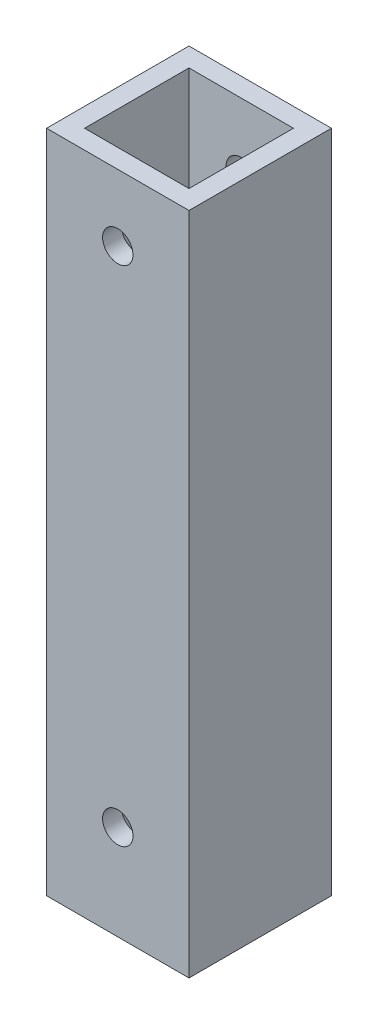
ISO-10303-21;
HEADER;
FILE_DESCRIPTION(('STEP AP214'),'2;1');
FILE_NAME('part.step','',(''),(''),'','','');
FILE_SCHEMA(('AUTOMOTIVE_DESIGN { 1 0 10303 214 1 1 1 1 }'));
ENDSEC;
DATA;
#1=APPLICATION_CONTEXT('core data for automotive mechanical design processes');
#2=APPLICATION_PROTOCOL_DEFINITION('international standard','automotive_design',2000,#1);
#3=PRODUCT_CONTEXT('',#1,'mechanical');
#4=PRODUCT('Part','Part','',(#3));
#5=PRODUCT_RELATED_PRODUCT_CATEGORY('part','',(#4));
#6=PRODUCT_DEFINITION_FORMATION('','',#4);
#7=PRODUCT_DEFINITION_CONTEXT('part definition',#1,'design');
#8=PRODUCT_DEFINITION('design','',#6,#7);
#9=PRODUCT_DEFINITION_SHAPE('','',#8);
#10=(LENGTH_UNIT() NAMED_UNIT(*) SI_UNIT(.MILLI.,.METRE.));
#11=(NAMED_UNIT(*) PLANE_ANGLE_UNIT() SI_UNIT($,.RADIAN.));
#12=(NAMED_UNIT(*) SI_UNIT($,.STERADIAN.) SOLID_ANGLE_UNIT());
#13=UNCERTAINTY_MEASURE_WITH_UNIT(LENGTH_MEASURE(1.E-05),#10,'distance_accuracy_value','');
#14=(GEOMETRIC_REPRESENTATION_CONTEXT(3) GLOBAL_UNCERTAINTY_ASSIGNED_CONTEXT((#13)) GLOBAL_UNIT_ASSIGNED_CONTEXT((#10,
#11,#12)) REPRESENTATION_CONTEXT('',''));
#15=CARTESIAN_POINT('',(0.,0.,0.));
#16=DIRECTION('',(0.,0.,1.));
#17=DIRECTION('',(1.,0.,0.));
#18=AXIS2_PLACEMENT_3D('',#15,#16,#17);
#19=CARTESIAN_POINT('',(0.,70.,0.));
#20=DIRECTION('',(0.,-1.,0.));
#21=DIRECTION('',(0.,0.,-1.));
#22=AXIS2_PLACEMENT_3D('',#19,#20,#21);
#23=PLANE('',#22);
#24=DIRECTION('',(0.,0.,1.));
#25=VECTOR('',#24,1.);
#26=CARTESIAN_POINT('',(0.,70.,0.));
#27=LINE('',#26,#25);
#28=CARTESIAN_POINT('',(0.,70.,-15.));
#29=VERTEX_POINT('',#28);
#30=CARTESIAN_POINT('',(0.,70.,0.));
#31=VERTEX_POINT('',#30);
#32=EDGE_CURVE('E147',#29,#31,#27,.T.);
#33=ORIENTED_EDGE('',*,*,#32,.T.);
#34=DIRECTION('',(1.,0.,0.));
#35=VECTOR('',#34,1.);
#36=CARTESIAN_POINT('',(0.,70.,0.));
#37=LINE('',#36,#35);
#38=CARTESIAN_POINT('',(15.,70.,0.));
#39=VERTEX_POINT('',#38);
#40=EDGE_CURVE('E150',#31,#39,#37,.T.);
#41=ORIENTED_EDGE('',*,*,#40,.T.);
#42=DIRECTION('',(0.,0.,-1.));
#43=VECTOR('',#42,1.);
#44=CARTESIAN_POINT('',(15.,70.,0.));
#45=LINE('',#44,#43);
#46=CARTESIAN_POINT('',(15.,70.,-15.));
#47=VERTEX_POINT('',#46);
#48=EDGE_CURVE('E153',#39,#47,#45,.T.);
#49=ORIENTED_EDGE('',*,*,#48,.T.);
#50=DIRECTION('',(-1.,0.,0.));
#51=VECTOR('',#50,1.);
#52=CARTESIAN_POINT('',(0.,70.,-15.));
#53=LINE('',#52,#51);
#54=EDGE_CURVE('E155',#47,#29,#53,.T.);
#55=ORIENTED_EDGE('',*,*,#54,.T.);
#56=EDGE_LOOP('',(#33,#41,#49,#55));
#57=FACE_BOUND('',#56,.T.);
#58=DIRECTION('',(1.,0.,0.));
#59=VECTOR('',#58,1.);
#60=CARTESIAN_POINT('',(2.,70.,-2.));
#61=LINE('',#60,#59);
#62=CARTESIAN_POINT('',(2.,70.,-2.));
#63=VERTEX_POINT('',#62);
#64=CARTESIAN_POINT('',(13.,70.,-2.));
#65=VERTEX_POINT('',#64);
#66=EDGE_CURVE('E109',#63,#65,#61,.T.);
#67=ORIENTED_EDGE('',*,*,#66,.F.);
#68=DIRECTION('',(0.,0.,1.));
#69=VECTOR('',#68,1.);
#70=CARTESIAN_POINT('',(2.,70.,-2.));
#71=LINE('',#70,#69);
#72=CARTESIAN_POINT('',(2.,70.,-13.));
#73=VERTEX_POINT('',#72);
#74=EDGE_CURVE('E131',#73,#63,#71,.T.);
#75=ORIENTED_EDGE('',*,*,#74,.F.);
#76=DIRECTION('',(-1.,0.,0.));
#77=VECTOR('',#76,1.);
#78=CARTESIAN_POINT('',(2.,70.,-13.));
#79=LINE('',#78,#77);
#80=CARTESIAN_POINT('',(13.,70.,-13.));
#81=VERTEX_POINT('',#80);
#82=EDGE_CURVE('E129',#81,#73,#79,.T.);
#83=ORIENTED_EDGE('',*,*,#82,.F.);
#84=DIRECTION('',(0.,0.,-1.));
#85=VECTOR('',#84,1.);
#86=CARTESIAN_POINT('',(13.,70.,-2.));
#87=LINE('',#86,#85);
#88=EDGE_CURVE('E117',#65,#81,#87,.T.);
#89=ORIENTED_EDGE('',*,*,#88,.F.);
#90=EDGE_LOOP('',(#67,#75,#83,#89));
#91=FACE_BOUND('',#90,.T.);
#92=ADVANCED_FACE('F42',(#57,#91),#23,.F.);
#93=CARTESIAN_POINT('',(0.,0.,0.));
#94=DIRECTION('',(0.,-1.,0.));
#95=DIRECTION('',(0.,0.,-1.));
#96=AXIS2_PLACEMENT_3D('',#93,#94,#95);
#97=PLANE('',#96);
#98=DIRECTION('',(0.,0.,1.));
#99=VECTOR('',#98,1.);
#100=CARTESIAN_POINT('',(0.,0.,0.));
#101=LINE('',#100,#99);
#102=CARTESIAN_POINT('',(0.,0.,-15.));
#103=VERTEX_POINT('',#102);
#104=CARTESIAN_POINT('',(0.,0.,0.));
#105=VERTEX_POINT('',#104);
#106=EDGE_CURVE('E125',#103,#105,#101,.T.);
#107=ORIENTED_EDGE('',*,*,#106,.F.);
#108=DIRECTION('',(-1.,0.,0.));
#109=VECTOR('',#108,1.);
#110=CARTESIAN_POINT('',(0.,0.,-15.));
#111=LINE('',#110,#109);
#112=CARTESIAN_POINT('',(15.,0.,-15.));
#113=VERTEX_POINT('',#112);
#114=EDGE_CURVE('E151',#113,#103,#111,.T.);
#115=ORIENTED_EDGE('',*,*,#114,.F.);
#116=DIRECTION('',(0.,0.,-1.));
#117=VECTOR('',#116,1.);
#118=CARTESIAN_POINT('',(15.,0.,0.));
#119=LINE('',#118,#117);
#120=CARTESIAN_POINT('',(15.,0.,0.));
#121=VERTEX_POINT('',#120);
#122=EDGE_CURVE('E162',#121,#113,#119,.T.);
#123=ORIENTED_EDGE('',*,*,#122,.F.);
#124=DIRECTION('',(1.,0.,0.));
#125=VECTOR('',#124,1.);
#126=CARTESIAN_POINT('',(0.,0.,0.));
#127=LINE('',#126,#125);
#128=EDGE_CURVE('E160',#105,#121,#127,.T.);
#129=ORIENTED_EDGE('',*,*,#128,.F.);
#130=EDGE_LOOP('',(#107,#115,#123,#129));
#131=FACE_BOUND('',#130,.T.);
#132=DIRECTION('',(0.,0.,1.));
#133=VECTOR('',#132,1.);
#134=CARTESIAN_POINT('',(2.,0.,-2.));
#135=LINE('',#134,#133);
#136=CARTESIAN_POINT('',(2.,0.,-13.));
#137=VERTEX_POINT('',#136);
#138=CARTESIAN_POINT('',(2.,0.,-2.));
#139=VERTEX_POINT('',#138);
#140=EDGE_CURVE('E118',#137,#139,#135,.T.);
#141=ORIENTED_EDGE('',*,*,#140,.T.);
#142=DIRECTION('',(1.,0.,0.));
#143=VECTOR('',#142,1.);
#144=CARTESIAN_POINT('',(2.,0.,-2.));
#145=LINE('',#144,#143);
#146=CARTESIAN_POINT('',(13.,0.,-2.));
#147=VERTEX_POINT('',#146);
#148=EDGE_CURVE('E67',#139,#147,#145,.T.);
#149=ORIENTED_EDGE('',*,*,#148,.T.);
#150=DIRECTION('',(0.,0.,-1.));
#151=VECTOR('',#150,1.);
#152=CARTESIAN_POINT('',(13.,0.,-2.));
#153=LINE('',#152,#151);
#154=CARTESIAN_POINT('',(13.,0.,-13.));
#155=VERTEX_POINT('',#154);
#156=EDGE_CURVE('E124',#147,#155,#153,.T.);
#157=ORIENTED_EDGE('',*,*,#156,.T.);
#158=DIRECTION('',(-1.,0.,0.));
#159=VECTOR('',#158,1.);
#160=CARTESIAN_POINT('',(2.,0.,-13.));
#161=LINE('',#160,#159);
#162=EDGE_CURVE('E139',#155,#137,#161,.T.);
#163=ORIENTED_EDGE('',*,*,#162,.T.);
#164=EDGE_LOOP('',(#141,#149,#157,#163));
#165=FACE_BOUND('',#164,.T.);
#166=ADVANCED_FACE('F209',(#131,#165),#97,.T.);
#167=CARTESIAN_POINT('',(0.,70.,0.));
#168=DIRECTION('',(1.,0.,0.));
#169=DIRECTION('',(0.,0.,-1.));
#170=AXIS2_PLACEMENT_3D('',#167,#168,#169);
#171=PLANE('',#170);
#172=ORIENTED_EDGE('',*,*,#106,.T.);
#173=DIRECTION('',(0.,-1.,0.));
#174=VECTOR('',#173,1.);
#175=CARTESIAN_POINT('',(0.,70.,0.));
#176=LINE('',#175,#174);
#177=EDGE_CURVE('E11',#31,#105,#176,.T.);
#178=ORIENTED_EDGE('',*,*,#177,.F.);
#179=ORIENTED_EDGE('',*,*,#32,.F.);
#180=DIRECTION('',(0.,-1.,0.));
#181=VECTOR('',#180,1.);
#182=CARTESIAN_POINT('',(0.,70.,-15.));
#183=LINE('',#182,#181);
#184=EDGE_CURVE('E157',#29,#103,#183,.T.);
#185=ORIENTED_EDGE('',*,*,#184,.T.);
#186=EDGE_LOOP('',(#172,#178,#179,#185));
#187=FACE_BOUND('',#186,.T.);
#188=ADVANCED_FACE('F44',(#187),#171,.F.);
#189=CARTESIAN_POINT('',(0.,70.,0.));
#190=DIRECTION('',(0.,0.,-1.));
#191=DIRECTION('',(-1.,0.,0.));
#192=AXIS2_PLACEMENT_3D('',#189,#190,#191);
#193=PLANE('',#192);
#194=CARTESIAN_POINT('',(7.49999999999985,63.0000000000004,0.));
#195=DIRECTION('',(0.,0.,-1.));
#196=DIRECTION('',(-1.,0.,0.));
#197=AXIS2_PLACEMENT_3D('',#194,#195,#196);
#198=CIRCLE('',#197,1.6);
#199=CARTESIAN_POINT('',(5.89999999999985,63.0000000000004,0.));
#200=VERTEX_POINT('',#199);
#201=EDGE_CURVE('E174',#200,#200,#198,.T.);
#202=ORIENTED_EDGE('',*,*,#201,.T.);
#203=EDGE_LOOP('',(#202));
#204=FACE_BOUND('',#203,.T.);
#205=CARTESIAN_POINT('',(7.49999999999985,10.0000000000004,0.));
#206=DIRECTION('',(0.,0.,-1.));
#207=DIRECTION('',(-1.,0.,0.));
#208=AXIS2_PLACEMENT_3D('',#205,#206,#207);
#209=CIRCLE('',#208,1.6);
#210=CARTESIAN_POINT('',(5.89999999999985,10.0000000000004,0.));
#211=VERTEX_POINT('',#210);
#212=EDGE_CURVE('E190',#211,#211,#209,.T.);
#213=ORIENTED_EDGE('',*,*,#212,.T.);
#214=EDGE_LOOP('',(#213));
#215=FACE_BOUND('',#214,.T.);
#216=ORIENTED_EDGE('',*,*,#128,.T.);
#217=DIRECTION('',(0.,-1.,0.));
#218=VECTOR('',#217,1.);
#219=CARTESIAN_POINT('',(15.,70.,0.));
#220=LINE('',#219,#218);
#221=EDGE_CURVE('E51',#39,#121,#220,.T.);
#222=ORIENTED_EDGE('',*,*,#221,.F.);
#223=ORIENTED_EDGE('',*,*,#40,.F.);
#224=ORIENTED_EDGE('',*,*,#177,.T.);
#225=EDGE_LOOP('',(#216,#222,#223,#224));
#226=FACE_BOUND('',#225,.T.);
#227=ADVANCED_FACE('F236',(#204,#215,#226),#193,.F.);
#228=CARTESIAN_POINT('',(15.,70.,0.));
#229=DIRECTION('',(-1.,0.,0.));
#230=DIRECTION('',(0.,0.,1.));
#231=AXIS2_PLACEMENT_3D('',#228,#229,#230);
#232=PLANE('',#231);
#233=ORIENTED_EDGE('',*,*,#122,.T.);
#234=DIRECTION('',(0.,-1.,0.));
#235=VECTOR('',#234,1.);
#236=CARTESIAN_POINT('',(15.,70.,-15.));
#237=LINE('',#236,#235);
#238=EDGE_CURVE('E167',#47,#113,#237,.T.);
#239=ORIENTED_EDGE('',*,*,#238,.F.);
#240=ORIENTED_EDGE('',*,*,#48,.F.);
#241=ORIENTED_EDGE('',*,*,#221,.T.);
#242=EDGE_LOOP('',(#233,#239,#240,#241));
#243=FACE_BOUND('',#242,.T.);
#244=ADVANCED_FACE('F233',(#243),#232,.F.);
#245=CARTESIAN_POINT('',(0.,70.,-15.));
#246=DIRECTION('',(0.,0.,1.));
#247=DIRECTION('',(1.,0.,0.));
#248=AXIS2_PLACEMENT_3D('',#245,#246,#247);
#249=PLANE('',#248);
#250=CARTESIAN_POINT('',(7.49999999999985,63.0000000000004,-15.));
#251=DIRECTION('',(0.,0.,-1.));
#252=DIRECTION('',(-1.,0.,0.));
#253=AXIS2_PLACEMENT_3D('',#250,#251,#252);
#254=CIRCLE('',#253,1.6);
#255=CARTESIAN_POINT('',(5.89999999999985,63.0000000000004,-15.));
#256=VERTEX_POINT('',#255);
#257=EDGE_CURVE('E180',#256,#256,#254,.T.);
#258=ORIENTED_EDGE('',*,*,#257,.F.);
#259=EDGE_LOOP('',(#258));
#260=FACE_BOUND('',#259,.T.);
#261=CARTESIAN_POINT('',(7.49999999999985,10.0000000000004,-15.));
#262=DIRECTION('',(0.,0.,-1.));
#263=DIRECTION('',(-1.,0.,0.));
#264=AXIS2_PLACEMENT_3D('',#261,#262,#263);
#265=CIRCLE('',#264,1.6);
#266=CARTESIAN_POINT('',(5.89999999999985,10.0000000000004,-15.));
#267=VERTEX_POINT('',#266);
#268=EDGE_CURVE('E185',#267,#267,#265,.T.);
#269=ORIENTED_EDGE('',*,*,#268,.F.);
#270=EDGE_LOOP('',(#269));
#271=FACE_BOUND('',#270,.T.);
#272=ORIENTED_EDGE('',*,*,#114,.T.);
#273=ORIENTED_EDGE('',*,*,#184,.F.);
#274=ORIENTED_EDGE('',*,*,#54,.F.);
#275=ORIENTED_EDGE('',*,*,#238,.T.);
#276=EDGE_LOOP('',(#272,#273,#274,#275));
#277=FACE_BOUND('',#276,.T.);
#278=ADVANCED_FACE('F230',(#260,#271,#277),#249,.F.);
#279=CARTESIAN_POINT('',(2.,70.,-2.));
#280=DIRECTION('',(0.,0.,-1.));
#281=DIRECTION('',(-1.,0.,0.));
#282=AXIS2_PLACEMENT_3D('',#279,#280,#281);
#283=PLANE('',#282);
#284=CARTESIAN_POINT('',(7.49999999999985,63.0000000000004,-2.));
#285=DIRECTION('',(0.,0.,-1.));
#286=DIRECTION('',(-1.,0.,0.));
#287=AXIS2_PLACEMENT_3D('',#284,#285,#286);
#288=CIRCLE('',#287,1.6);
#289=CARTESIAN_POINT('',(5.89999999999985,63.0000000000004,-2.));
#290=VERTEX_POINT('',#289);
#291=EDGE_CURVE('E137',#290,#290,#288,.T.);
#292=ORIENTED_EDGE('',*,*,#291,.F.);
#293=EDGE_LOOP('',(#292));
#294=FACE_BOUND('',#293,.T.);
#295=CARTESIAN_POINT('',(7.49999999999985,10.0000000000004,-2.));
#296=DIRECTION('',(0.,0.,-1.));
#297=DIRECTION('',(-1.,0.,0.));
#298=AXIS2_PLACEMENT_3D('',#295,#296,#297);
#299=CIRCLE('',#298,1.6);
#300=CARTESIAN_POINT('',(5.89999999999985,10.0000000000004,-2.));
#301=VERTEX_POINT('',#300);
#302=EDGE_CURVE('E173',#301,#301,#299,.T.);
#303=ORIENTED_EDGE('',*,*,#302,.F.);
#304=EDGE_LOOP('',(#303));
#305=FACE_BOUND('',#304,.T.);
#306=ORIENTED_EDGE('',*,*,#148,.F.);
#307=DIRECTION('',(0.,-1.,0.));
#308=VECTOR('',#307,1.);
#309=CARTESIAN_POINT('',(2.,70.,-2.));
#310=LINE('',#309,#308);
#311=EDGE_CURVE('E113',#63,#139,#310,.T.);
#312=ORIENTED_EDGE('',*,*,#311,.F.);
#313=ORIENTED_EDGE('',*,*,#66,.T.);
#314=DIRECTION('',(0.,-1.,0.));
#315=VECTOR('',#314,1.);
#316=CARTESIAN_POINT('',(13.,70.,-2.));
#317=LINE('',#316,#315);
#318=EDGE_CURVE('E112',#65,#147,#317,.T.);
#319=ORIENTED_EDGE('',*,*,#318,.T.);
#320=EDGE_LOOP('',(#306,#312,#313,#319));
#321=FACE_BOUND('',#320,.T.);
#322=ADVANCED_FACE('F111',(#294,#305,#321),#283,.T.);
#323=CARTESIAN_POINT('',(13.,70.,-2.));
#324=DIRECTION('',(-1.,0.,0.));
#325=DIRECTION('',(0.,0.,1.));
#326=AXIS2_PLACEMENT_3D('',#323,#324,#325);
#327=PLANE('',#326);
#328=ORIENTED_EDGE('',*,*,#156,.F.);
#329=ORIENTED_EDGE('',*,*,#318,.F.);
#330=ORIENTED_EDGE('',*,*,#88,.T.);
#331=DIRECTION('',(0.,-1.,0.));
#332=VECTOR('',#331,1.);
#333=CARTESIAN_POINT('',(13.,70.,-13.));
#334=LINE('',#333,#332);
#335=EDGE_CURVE('E126',#81,#155,#334,.T.);
#336=ORIENTED_EDGE('',*,*,#335,.T.);
#337=EDGE_LOOP('',(#328,#329,#330,#336));
#338=FACE_BOUND('',#337,.T.);
#339=ADVANCED_FACE('F121',(#338),#327,.T.);
#340=CARTESIAN_POINT('',(2.,70.,-13.));
#341=DIRECTION('',(0.,0.,1.));
#342=DIRECTION('',(1.,0.,0.));
#343=AXIS2_PLACEMENT_3D('',#340,#341,#342);
#344=PLANE('',#343);
#345=CARTESIAN_POINT('',(7.49999999999985,63.0000000000004,-13.));
#346=DIRECTION('',(0.,0.,1.));
#347=DIRECTION('',(1.,0.,0.));
#348=AXIS2_PLACEMENT_3D('',#345,#346,#347);
#349=CIRCLE('',#348,1.6);
#350=CARTESIAN_POINT('',(9.09999999999985,63.0000000000004,-13.));
#351=VERTEX_POINT('',#350);
#352=EDGE_CURVE('E46',#351,#351,#349,.T.);
#353=ORIENTED_EDGE('',*,*,#352,.F.);
#354=EDGE_LOOP('',(#353));
#355=FACE_BOUND('',#354,.T.);
#356=CARTESIAN_POINT('',(7.49999999999985,10.0000000000004,-13.));
#357=DIRECTION('',(0.,0.,1.));
#358=DIRECTION('',(1.,0.,0.));
#359=AXIS2_PLACEMENT_3D('',#356,#357,#358);
#360=CIRCLE('',#359,1.6);
#361=CARTESIAN_POINT('',(9.09999999999985,10.0000000000004,-13.));
#362=VERTEX_POINT('',#361);
#363=EDGE_CURVE('E171',#362,#362,#360,.T.);
#364=ORIENTED_EDGE('',*,*,#363,.F.);
#365=EDGE_LOOP('',(#364));
#366=FACE_BOUND('',#365,.T.);
#367=ORIENTED_EDGE('',*,*,#162,.F.);
#368=ORIENTED_EDGE('',*,*,#335,.F.);
#369=ORIENTED_EDGE('',*,*,#82,.T.);
#370=DIRECTION('',(0.,-1.,0.));
#371=VECTOR('',#370,1.);
#372=CARTESIAN_POINT('',(2.,70.,-13.));
#373=LINE('',#372,#371);
#374=EDGE_CURVE('E59',#73,#137,#373,.T.);
#375=ORIENTED_EDGE('',*,*,#374,.T.);
#376=EDGE_LOOP('',(#367,#368,#369,#375));
#377=FACE_BOUND('',#376,.T.);
#378=ADVANCED_FACE('F201',(#355,#366,#377),#344,.T.);
#379=CARTESIAN_POINT('',(2.,70.,-2.));
#380=DIRECTION('',(1.,0.,0.));
#381=DIRECTION('',(0.,0.,-1.));
#382=AXIS2_PLACEMENT_3D('',#379,#380,#381);
#383=PLANE('',#382);
#384=ORIENTED_EDGE('',*,*,#140,.F.);
#385=ORIENTED_EDGE('',*,*,#374,.F.);
#386=ORIENTED_EDGE('',*,*,#74,.T.);
#387=ORIENTED_EDGE('',*,*,#311,.T.);
#388=EDGE_LOOP('',(#384,#385,#386,#387));
#389=FACE_BOUND('',#388,.T.);
#390=ADVANCED_FACE('F204',(#389),#383,.T.);
#391=CARTESIAN_POINT('',(7.49999999999985,10.0000000000004,0.));
#392=DIRECTION('',(0.,0.,-1.));
#393=DIRECTION('',(-1.,0.,0.));
#394=AXIS2_PLACEMENT_3D('',#391,#392,#393);
#395=CYLINDRICAL_SURFACE('',#394,1.6);
#396=ORIENTED_EDGE('',*,*,#363,.T.);
#397=EDGE_LOOP('',(#396));
#398=FACE_BOUND('',#397,.T.);
#399=ORIENTED_EDGE('',*,*,#268,.T.);
#400=EDGE_LOOP('',(#399));
#401=FACE_BOUND('',#400,.T.);
#402=ADVANCED_FACE('F211',(#398,#401),#395,.F.);
#403=CARTESIAN_POINT('',(7.49999999999985,63.0000000000004,0.));
#404=DIRECTION('',(0.,0.,-1.));
#405=DIRECTION('',(-1.,0.,0.));
#406=AXIS2_PLACEMENT_3D('',#403,#404,#405);
#407=CYLINDRICAL_SURFACE('',#406,1.6);
#408=ORIENTED_EDGE('',*,*,#352,.T.);
#409=EDGE_LOOP('',(#408));
#410=FACE_BOUND('',#409,.T.);
#411=ORIENTED_EDGE('',*,*,#257,.T.);
#412=EDGE_LOOP('',(#411));
#413=FACE_BOUND('',#412,.T.);
#414=ADVANCED_FACE('F198',(#410,#413),#407,.F.);
#415=ORIENTED_EDGE('',*,*,#302,.T.);
#416=EDGE_LOOP('',(#415));
#417=FACE_BOUND('',#416,.T.);
#418=ORIENTED_EDGE('',*,*,#212,.F.);
#419=EDGE_LOOP('',(#418));
#420=FACE_BOUND('',#419,.T.);
#421=ADVANCED_FACE('F218',(#417,#420),#395,.F.);
#422=ORIENTED_EDGE('',*,*,#291,.T.);
#423=EDGE_LOOP('',(#422));
#424=FACE_BOUND('',#423,.T.);
#425=ORIENTED_EDGE('',*,*,#201,.F.);
#426=EDGE_LOOP('',(#425));
#427=FACE_BOUND('',#426,.T.);
#428=ADVANCED_FACE('F259',(#424,#427),#407,.F.);
#429=CLOSED_SHELL('',(#92,#166,#188,#227,#244,#278,#322,#339,#378,#390,#402,#414,#421,#428));
#430=MANIFOLD_SOLID_BREP('B2',#429);
#431=ADVANCED_BREP_SHAPE_REPRESENTATION('',(#18,#430),#14);
#432=SHAPE_DEFINITION_REPRESENTATION(#9,#431);
ENDSEC;
END-ISO-10303-21;
